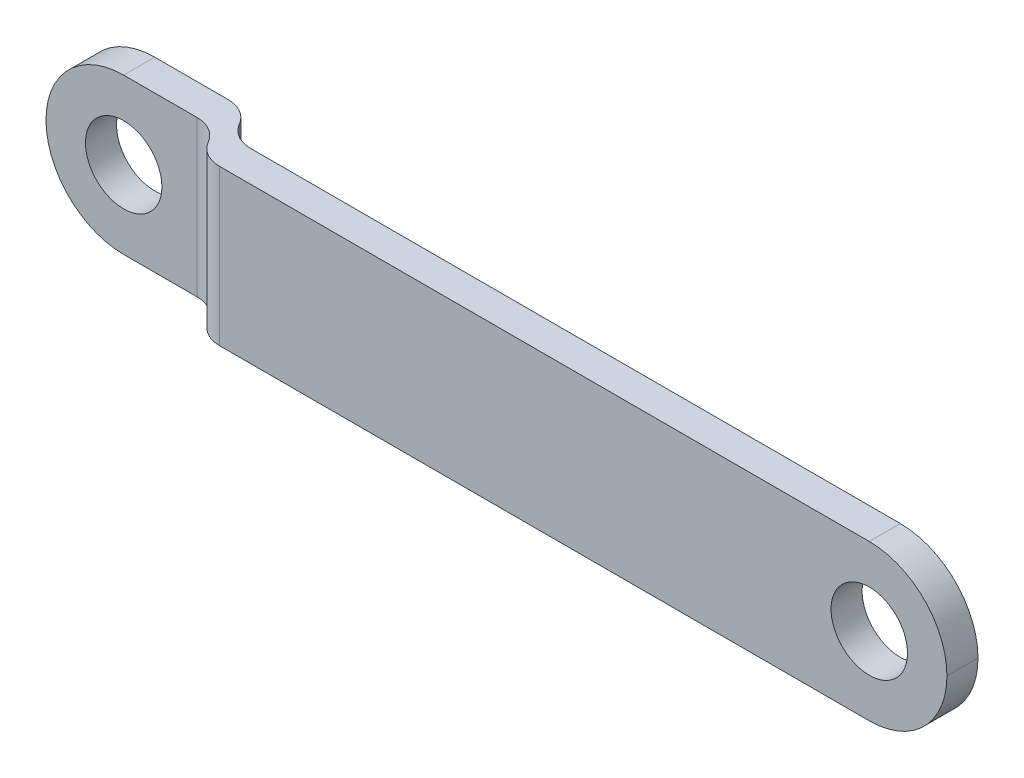
ISO-10303-21;
HEADER;
FILE_DESCRIPTION(('STEP AP214'),'2;1');
FILE_NAME('part.step','',(''),(''),'','','');
FILE_SCHEMA(('AUTOMOTIVE_DESIGN { 1 0 10303 214 1 1 1 1 }'));
ENDSEC;
DATA;
#1=APPLICATION_CONTEXT('core data for automotive mechanical design processes');
#2=APPLICATION_PROTOCOL_DEFINITION('international standard','automotive_design',2000,#1);
#3=PRODUCT_CONTEXT('',#1,'mechanical');
#4=PRODUCT('Part','Part','',(#3));
#5=PRODUCT_RELATED_PRODUCT_CATEGORY('part','',(#4));
#6=PRODUCT_DEFINITION_FORMATION('','',#4);
#7=PRODUCT_DEFINITION_CONTEXT('part definition',#1,'design');
#8=PRODUCT_DEFINITION('design','',#6,#7);
#9=PRODUCT_DEFINITION_SHAPE('','',#8);
#10=(LENGTH_UNIT() NAMED_UNIT(*) SI_UNIT(.MILLI.,.METRE.));
#11=(NAMED_UNIT(*) PLANE_ANGLE_UNIT() SI_UNIT($,.RADIAN.));
#12=(NAMED_UNIT(*) SI_UNIT($,.STERADIAN.) SOLID_ANGLE_UNIT());
#13=UNCERTAINTY_MEASURE_WITH_UNIT(LENGTH_MEASURE(1.E-05),#10,'distance_accuracy_value','');
#14=(GEOMETRIC_REPRESENTATION_CONTEXT(3) GLOBAL_UNCERTAINTY_ASSIGNED_CONTEXT((#13)) GLOBAL_UNIT_ASSIGNED_CONTEXT((#10,
#11,#12)) REPRESENTATION_CONTEXT('',''));
#15=CARTESIAN_POINT('',(0.,0.,0.));
#16=DIRECTION('',(0.,0.,1.));
#17=DIRECTION('',(1.,0.,0.));
#18=AXIS2_PLACEMENT_3D('',#15,#16,#17);
#19=CARTESIAN_POINT('',(-63.5,0.,5.08));
#20=DIRECTION('',(0.,0.,1.));
#21=DIRECTION('',(1.,0.,0.));
#22=AXIS2_PLACEMENT_3D('',#19,#20,#21);
#23=CYLINDRICAL_SURFACE('',#22,6.25);
#24=CARTESIAN_POINT('',(-63.5,0.,-5.08));
#25=DIRECTION('',(0.,0.,1.));
#26=DIRECTION('',(1.,0.,0.));
#27=AXIS2_PLACEMENT_3D('',#24,#25,#26);
#28=CIRCLE('',#27,6.24999999999999);
#29=CARTESIAN_POINT('',(-57.25,0.,-5.08));
#30=VERTEX_POINT('',#29);
#31=EDGE_CURVE('E230',#30,#30,#28,.T.);
#32=ORIENTED_EDGE('',*,*,#31,.F.);
#33=EDGE_LOOP('',(#32));
#34=FACE_BOUND('',#33,.T.);
#35=CARTESIAN_POINT('',(-63.5,0.,0.));
#36=DIRECTION('',(0.,0.,1.));
#37=DIRECTION('',(1.,0.,0.));
#38=AXIS2_PLACEMENT_3D('',#35,#36,#37);
#39=CIRCLE('',#38,6.24999999999999);
#40=CARTESIAN_POINT('',(-57.25,0.,0.));
#41=VERTEX_POINT('',#40);
#42=EDGE_CURVE('E142',#41,#41,#39,.T.);
#43=ORIENTED_EDGE('',*,*,#42,.T.);
#44=EDGE_LOOP('',(#43));
#45=FACE_BOUND('',#44,.T.);
#46=ADVANCED_FACE('F47',(#34,#45),#23,.F.);
#47=CARTESIAN_POINT('',(-63.5,0.,5.08));
#48=DIRECTION('',(0.,0.,-1.));
#49=DIRECTION('',(-1.,0.,0.));
#50=AXIS2_PLACEMENT_3D('',#47,#48,#49);
#51=CYLINDRICAL_SURFACE('',#50,12.7);
#52=DIRECTION('',(0.,0.,-1.));
#53=VECTOR('',#52,1.);
#54=CARTESIAN_POINT('',(-63.5,-12.7,5.08));
#55=LINE('',#54,#53);
#56=CARTESIAN_POINT('',(-63.5,-12.7,0.));
#57=VERTEX_POINT('',#56);
#58=CARTESIAN_POINT('',(-63.5,-12.7,-5.08));
#59=VERTEX_POINT('',#58);
#60=EDGE_CURVE('E147',#57,#59,#55,.T.);
#61=ORIENTED_EDGE('',*,*,#60,.F.);
#62=CARTESIAN_POINT('',(-63.5,0.,0.));
#63=DIRECTION('',(0.,0.,1.));
#64=DIRECTION('',(1.,0.,0.));
#65=AXIS2_PLACEMENT_3D('',#62,#63,#64);
#66=CIRCLE('',#65,12.7);
#67=CARTESIAN_POINT('',(-63.5,12.7,0.));
#68=VERTEX_POINT('',#67);
#69=EDGE_CURVE('E130',#68,#57,#66,.T.);
#70=ORIENTED_EDGE('',*,*,#69,.F.);
#71=DIRECTION('',(0.,0.,-1.));
#72=VECTOR('',#71,1.);
#73=CARTESIAN_POINT('',(-63.5,12.7,5.08));
#74=LINE('',#73,#72);
#75=CARTESIAN_POINT('',(-63.5,12.7,-5.08));
#76=VERTEX_POINT('',#75);
#77=EDGE_CURVE('E181',#76,#68,#74,.F.);
#78=ORIENTED_EDGE('',*,*,#77,.F.);
#79=CARTESIAN_POINT('',(-63.5,0.,-5.08));
#80=DIRECTION('',(0.,0.,1.));
#81=DIRECTION('',(1.,0.,0.));
#82=AXIS2_PLACEMENT_3D('',#79,#80,#81);
#83=CIRCLE('',#82,12.7);
#84=EDGE_CURVE('E154',#76,#59,#83,.T.);
#85=ORIENTED_EDGE('',*,*,#84,.T.);
#86=EDGE_LOOP('',(#61,#70,#78,#85));
#87=FACE_BOUND('',#86,.T.);
#88=ADVANCED_FACE('F152',(#87),#51,.T.);
#89=CARTESIAN_POINT('',(-76.2,12.7,5.08));
#90=DIRECTION('',(0.,-1.,0.));
#91=DIRECTION('',(0.,0.,-1.));
#92=AXIS2_PLACEMENT_3D('',#89,#90,#91);
#93=PLANE('',#92);
#94=CARTESIAN_POINT('',(-42.7249159472084,12.7,-5.08));
#95=DIRECTION('',(0.,-1.,0.));
#96=DIRECTION('',(0.,0.,-1.));
#97=AXIS2_PLACEMENT_3D('',#94,#95,#96);
#98=CIRCLE('',#97,5.08);
#99=CARTESIAN_POINT('',(-42.7249159472084,12.7,0.));
#100=VERTEX_POINT('',#99);
#101=CARTESIAN_POINT('',(-47.1243249984334,12.7,-2.54));
#102=VERTEX_POINT('',#101);
#103=EDGE_CURVE('E196',#100,#102,#98,.T.);
#104=ORIENTED_EDGE('',*,*,#103,.T.);
#105=CARTESIAN_POINT('',(-51.5237340496583,12.7,0.));
#106=DIRECTION('',(0.,-1.,0.));
#107=DIRECTION('',(0.,0.,-1.));
#108=AXIS2_PLACEMENT_3D('',#105,#106,#107);
#109=CIRCLE('',#108,5.08);
#110=CARTESIAN_POINT('',(-51.5237340496583,12.7,-5.08));
#111=VERTEX_POINT('',#110);
#112=EDGE_CURVE('E213',#102,#111,#109,.F.);
#113=ORIENTED_EDGE('',*,*,#112,.T.);
#114=DIRECTION('',(-1.,0.,0.));
#115=VECTOR('',#114,1.);
#116=CARTESIAN_POINT('',(-47.8049159472084,12.7,-5.08));
#117=LINE('',#116,#115);
#118=EDGE_CURVE('E234',#111,#76,#117,.T.);
#119=ORIENTED_EDGE('',*,*,#118,.T.);
#120=ORIENTED_EDGE('',*,*,#77,.T.);
#121=DIRECTION('',(-1.,0.,0.));
#122=VECTOR('',#121,1.);
#123=CARTESIAN_POINT('',(-47.8049159472084,12.7,0.));
#124=LINE('',#123,#122);
#125=CARTESIAN_POINT('',(-51.5237340496583,12.7,0.));
#126=VERTEX_POINT('',#125);
#127=EDGE_CURVE('E136',#126,#68,#124,.T.);
#128=ORIENTED_EDGE('',*,*,#127,.F.);
#129=CARTESIAN_POINT('',(-51.5237340496583,12.7,5.08));
#130=DIRECTION('',(0.,-1.,0.));
#131=DIRECTION('',(0.,0.,-1.));
#132=AXIS2_PLACEMENT_3D('',#129,#130,#131);
#133=CIRCLE('',#132,5.08);
#134=CARTESIAN_POINT('',(-47.1243249984334,12.7,2.54));
#135=VERTEX_POINT('',#134);
#136=EDGE_CURVE('E56',#126,#135,#133,.T.);
#137=ORIENTED_EDGE('',*,*,#136,.T.);
#138=CARTESIAN_POINT('',(-42.7249159472084,12.7,0.));
#139=DIRECTION('',(0.,-1.,0.));
#140=DIRECTION('',(0.,0.,-1.));
#141=AXIS2_PLACEMENT_3D('',#138,#139,#140);
#142=CIRCLE('',#141,5.08);
#143=CARTESIAN_POINT('',(-42.7249159472084,12.7,5.08));
#144=VERTEX_POINT('',#143);
#145=EDGE_CURVE('E200',#135,#144,#142,.F.);
#146=ORIENTED_EDGE('',*,*,#145,.T.);
#147=DIRECTION('',(-1.,0.,0.));
#148=VECTOR('',#147,1.);
#149=CARTESIAN_POINT('',(-76.2,12.7,5.08));
#150=LINE('',#149,#148);
#151=CARTESIAN_POINT('',(63.4999999999999,12.7,5.08));
#152=VERTEX_POINT('',#151);
#153=EDGE_CURVE('E251',#152,#144,#150,.T.);
#154=ORIENTED_EDGE('',*,*,#153,.F.);
#155=DIRECTION('',(0.,0.,-1.));
#156=VECTOR('',#155,1.);
#157=CARTESIAN_POINT('',(63.5,12.7,5.08));
#158=LINE('',#157,#156);
#159=CARTESIAN_POINT('',(63.4999999999999,12.7,0.));
#160=VERTEX_POINT('',#159);
#161=EDGE_CURVE('E178',#152,#160,#158,.T.);
#162=ORIENTED_EDGE('',*,*,#161,.T.);
#163=DIRECTION('',(-1.,0.,0.));
#164=VECTOR('',#163,1.);
#165=CARTESIAN_POINT('',(-76.2,12.7,0.));
#166=LINE('',#165,#164);
#167=EDGE_CURVE('E250',#160,#100,#166,.T.);
#168=ORIENTED_EDGE('',*,*,#167,.T.);
#169=EDGE_LOOP('',(#104,#113,#119,#120,#128,#137,#146,#154,#162,#168));
#170=FACE_BOUND('',#169,.T.);
#171=ADVANCED_FACE('F228',(#170),#93,.F.);
#172=CARTESIAN_POINT('',(-76.2,-12.7,5.08));
#173=DIRECTION('',(0.,1.,0.));
#174=DIRECTION('',(0.,0.,1.));
#175=AXIS2_PLACEMENT_3D('',#172,#173,#174);
#176=PLANE('',#175);
#177=DIRECTION('',(1.,0.,0.));
#178=VECTOR('',#177,1.);
#179=CARTESIAN_POINT('',(-63.5,-12.7,-5.08));
#180=LINE('',#179,#178);
#181=CARTESIAN_POINT('',(-51.5237340496583,-12.7,-5.08));
#182=VERTEX_POINT('',#181);
#183=EDGE_CURVE('E190',#59,#182,#180,.T.);
#184=ORIENTED_EDGE('',*,*,#183,.T.);
#185=CARTESIAN_POINT('',(-51.5237340496583,-12.7,0.));
#186=DIRECTION('',(0.,1.,0.));
#187=DIRECTION('',(0.,0.,1.));
#188=AXIS2_PLACEMENT_3D('',#185,#186,#187);
#189=CIRCLE('',#188,5.08);
#190=CARTESIAN_POINT('',(-47.1243249984334,-12.7,-2.54));
#191=VERTEX_POINT('',#190);
#192=EDGE_CURVE('E219',#182,#191,#189,.F.);
#193=ORIENTED_EDGE('',*,*,#192,.T.);
#194=CARTESIAN_POINT('',(-42.7249159472084,-12.7,-5.08));
#195=DIRECTION('',(0.,1.,0.));
#196=DIRECTION('',(0.,0.,1.));
#197=AXIS2_PLACEMENT_3D('',#194,#195,#196);
#198=CIRCLE('',#197,5.08);
#199=CARTESIAN_POINT('',(-42.7249159472084,-12.7,0.));
#200=VERTEX_POINT('',#199);
#201=EDGE_CURVE('E193',#191,#200,#198,.T.);
#202=ORIENTED_EDGE('',*,*,#201,.T.);
#203=DIRECTION('',(1.,0.,0.));
#204=VECTOR('',#203,1.);
#205=CARTESIAN_POINT('',(-76.2,-12.7,0.));
#206=LINE('',#205,#204);
#207=CARTESIAN_POINT('',(63.4999999999999,-12.7,0.));
#208=VERTEX_POINT('',#207);
#209=EDGE_CURVE('E255',#200,#208,#206,.T.);
#210=ORIENTED_EDGE('',*,*,#209,.T.);
#211=DIRECTION('',(0.,0.,-1.));
#212=VECTOR('',#211,1.);
#213=CARTESIAN_POINT('',(63.5,-12.7,5.08));
#214=LINE('',#213,#212);
#215=CARTESIAN_POINT('',(63.4999999999999,-12.7,5.08));
#216=VERTEX_POINT('',#215);
#217=EDGE_CURVE('E158',#208,#216,#214,.F.);
#218=ORIENTED_EDGE('',*,*,#217,.T.);
#219=DIRECTION('',(1.,0.,0.));
#220=VECTOR('',#219,1.);
#221=CARTESIAN_POINT('',(-76.2,-12.7,5.08));
#222=LINE('',#221,#220);
#223=CARTESIAN_POINT('',(-42.7249159472084,-12.7,5.08));
#224=VERTEX_POINT('',#223);
#225=EDGE_CURVE('E165',#224,#216,#222,.T.);
#226=ORIENTED_EDGE('',*,*,#225,.F.);
#227=CARTESIAN_POINT('',(-42.7249159472084,-12.7,0.));
#228=DIRECTION('',(0.,1.,0.));
#229=DIRECTION('',(0.,0.,1.));
#230=AXIS2_PLACEMENT_3D('',#227,#228,#229);
#231=CIRCLE('',#230,5.08);
#232=CARTESIAN_POINT('',(-47.1243249984334,-12.7,2.54));
#233=VERTEX_POINT('',#232);
#234=EDGE_CURVE('E206',#224,#233,#231,.F.);
#235=ORIENTED_EDGE('',*,*,#234,.T.);
#236=CARTESIAN_POINT('',(-51.5237340496583,-12.7,5.08));
#237=DIRECTION('',(0.,1.,0.));
#238=DIRECTION('',(0.,0.,1.));
#239=AXIS2_PLACEMENT_3D('',#236,#237,#238);
#240=CIRCLE('',#239,5.08);
#241=CARTESIAN_POINT('',(-51.5237340496583,-12.7,0.));
#242=VERTEX_POINT('',#241);
#243=EDGE_CURVE('E12',#233,#242,#240,.T.);
#244=ORIENTED_EDGE('',*,*,#243,.T.);
#245=DIRECTION('',(1.,0.,0.));
#246=VECTOR('',#245,1.);
#247=CARTESIAN_POINT('',(-63.5,-12.7,0.));
#248=LINE('',#247,#246);
#249=EDGE_CURVE('E134',#57,#242,#248,.T.);
#250=ORIENTED_EDGE('',*,*,#249,.F.);
#251=ORIENTED_EDGE('',*,*,#60,.T.);
#252=EDGE_LOOP('',(#184,#193,#202,#210,#218,#226,#235,#244,#250,#251));
#253=FACE_BOUND('',#252,.T.);
#254=ADVANCED_FACE('F146',(#253),#176,.F.);
#255=CARTESIAN_POINT('',(0.,0.,5.08));
#256=DIRECTION('',(0.,0.,-1.));
#257=DIRECTION('',(-1.,0.,0.));
#258=AXIS2_PLACEMENT_3D('',#255,#256,#257);
#259=PLANE('',#258);
#260=CARTESIAN_POINT('',(63.5,0.,5.08));
#261=DIRECTION('',(0.,0.,1.));
#262=DIRECTION('',(1.,0.,0.));
#263=AXIS2_PLACEMENT_3D('',#260,#261,#262);
#264=CIRCLE('',#263,6.24999999999999);
#265=CARTESIAN_POINT('',(69.75,0.,5.08));
#266=VERTEX_POINT('',#265);
#267=EDGE_CURVE('E189',#266,#266,#264,.T.);
#268=ORIENTED_EDGE('',*,*,#267,.F.);
#269=EDGE_LOOP('',(#268));
#270=FACE_BOUND('',#269,.T.);
#271=ORIENTED_EDGE('',*,*,#153,.T.);
#272=DIRECTION('',(0.,1.,0.));
#273=VECTOR('',#272,1.);
#274=CARTESIAN_POINT('',(-42.7249159472084,0.,5.08));
#275=LINE('',#274,#273);
#276=EDGE_CURVE('E203',#144,#224,#275,.F.);
#277=ORIENTED_EDGE('',*,*,#276,.T.);
#278=ORIENTED_EDGE('',*,*,#225,.T.);
#279=CARTESIAN_POINT('',(63.5,0.,5.08));
#280=DIRECTION('',(0.,0.,-1.));
#281=DIRECTION('',(-1.,0.,0.));
#282=AXIS2_PLACEMENT_3D('',#279,#280,#281);
#283=CIRCLE('',#282,12.7);
#284=CARTESIAN_POINT('',(76.2,0.,5.08));
#285=VERTEX_POINT('',#284);
#286=EDGE_CURVE('E175',#216,#285,#283,.F.);
#287=ORIENTED_EDGE('',*,*,#286,.T.);
#288=CARTESIAN_POINT('',(63.5,0.,5.08));
#289=DIRECTION('',(0.,0.,-1.));
#290=DIRECTION('',(-1.,0.,0.));
#291=AXIS2_PLACEMENT_3D('',#288,#289,#290);
#292=CIRCLE('',#291,12.7);
#293=EDGE_CURVE('E172',#285,#152,#292,.F.);
#294=ORIENTED_EDGE('',*,*,#293,.T.);
#295=EDGE_LOOP('',(#271,#277,#278,#287,#294));
#296=FACE_BOUND('',#295,.T.);
#297=ADVANCED_FACE('F278',(#270,#296),#259,.F.);
#298=CARTESIAN_POINT('',(0.,0.,0.));
#299=DIRECTION('',(0.,0.,-1.));
#300=DIRECTION('',(-1.,0.,0.));
#301=AXIS2_PLACEMENT_3D('',#298,#299,#300);
#302=PLANE('',#301);
#303=ORIENTED_EDGE('',*,*,#209,.F.);
#304=DIRECTION('',(0.,-1.,0.));
#305=VECTOR('',#304,1.);
#306=CARTESIAN_POINT('',(-42.7249159472084,12.7,0.));
#307=LINE('',#306,#305);
#308=EDGE_CURVE('E184',#200,#100,#307,.F.);
#309=ORIENTED_EDGE('',*,*,#308,.T.);
#310=ORIENTED_EDGE('',*,*,#167,.F.);
#311=CARTESIAN_POINT('',(63.5,0.,0.));
#312=DIRECTION('',(0.,0.,-1.));
#313=DIRECTION('',(-1.,0.,0.));
#314=AXIS2_PLACEMENT_3D('',#311,#312,#313);
#315=CIRCLE('',#314,12.7);
#316=CARTESIAN_POINT('',(76.2,0.,0.));
#317=VERTEX_POINT('',#316);
#318=EDGE_CURVE('E157',#160,#317,#315,.T.);
#319=ORIENTED_EDGE('',*,*,#318,.T.);
#320=CARTESIAN_POINT('',(63.5,0.,0.));
#321=DIRECTION('',(0.,0.,-1.));
#322=DIRECTION('',(-1.,0.,0.));
#323=AXIS2_PLACEMENT_3D('',#320,#321,#322);
#324=CIRCLE('',#323,12.7);
#325=EDGE_CURVE('E162',#317,#208,#324,.T.);
#326=ORIENTED_EDGE('',*,*,#325,.T.);
#327=EDGE_LOOP('',(#303,#309,#310,#319,#326));
#328=FACE_BOUND('',#327,.T.);
#329=CARTESIAN_POINT('',(63.5,0.,0.));
#330=DIRECTION('',(0.,0.,1.));
#331=DIRECTION('',(1.,0.,0.));
#332=AXIS2_PLACEMENT_3D('',#329,#330,#331);
#333=CIRCLE('',#332,6.25000000000001);
#334=CARTESIAN_POINT('',(69.75,0.,0.));
#335=VERTEX_POINT('',#334);
#336=EDGE_CURVE('E246',#335,#335,#333,.T.);
#337=ORIENTED_EDGE('',*,*,#336,.T.);
#338=EDGE_LOOP('',(#337));
#339=FACE_BOUND('',#338,.T.);
#340=ADVANCED_FACE('F268',(#328,#339),#302,.T.);
#341=CARTESIAN_POINT('',(63.5,0.,5.08));
#342=DIRECTION('',(0.,0.,1.));
#343=DIRECTION('',(1.,0.,0.));
#344=AXIS2_PLACEMENT_3D('',#341,#342,#343);
#345=CYLINDRICAL_SURFACE('',#344,6.25);
#346=ORIENTED_EDGE('',*,*,#336,.F.);
#347=EDGE_LOOP('',(#346));
#348=FACE_BOUND('',#347,.T.);
#349=ORIENTED_EDGE('',*,*,#267,.T.);
#350=EDGE_LOOP('',(#349));
#351=FACE_BOUND('',#350,.T.);
#352=ADVANCED_FACE('F316',(#348,#351),#345,.F.);
#353=CARTESIAN_POINT('',(63.5,0.,5.08));
#354=DIRECTION('',(0.,0.,-1.));
#355=DIRECTION('',(-1.,0.,0.));
#356=AXIS2_PLACEMENT_3D('',#353,#354,#355);
#357=CYLINDRICAL_SURFACE('',#356,12.7);
#358=ORIENTED_EDGE('',*,*,#161,.F.);
#359=ORIENTED_EDGE('',*,*,#293,.F.);
#360=DIRECTION('',(0.,0.,-1.));
#361=VECTOR('',#360,1.);
#362=CARTESIAN_POINT('',(76.2,0.,5.08));
#363=LINE('',#362,#361);
#364=EDGE_CURVE('E185',#317,#285,#363,.F.);
#365=ORIENTED_EDGE('',*,*,#364,.F.);
#366=ORIENTED_EDGE('',*,*,#318,.F.);
#367=EDGE_LOOP('',(#358,#359,#365,#366));
#368=FACE_BOUND('',#367,.T.);
#369=ADVANCED_FACE('F282',(#368),#357,.T.);
#370=CARTESIAN_POINT('',(63.5,0.,5.08));
#371=DIRECTION('',(0.,0.,-1.));
#372=DIRECTION('',(-1.,0.,0.));
#373=AXIS2_PLACEMENT_3D('',#370,#371,#372);
#374=CYLINDRICAL_SURFACE('',#373,12.7);
#375=ORIENTED_EDGE('',*,*,#286,.F.);
#376=ORIENTED_EDGE('',*,*,#217,.F.);
#377=ORIENTED_EDGE('',*,*,#325,.F.);
#378=ORIENTED_EDGE('',*,*,#364,.T.);
#379=EDGE_LOOP('',(#375,#376,#377,#378));
#380=FACE_BOUND('',#379,.T.);
#381=ADVANCED_FACE('F275',(#380),#374,.T.);
#382=CARTESIAN_POINT('',(-63.5,0.,-5.08));
#383=DIRECTION('',(0.,0.,1.));
#384=DIRECTION('',(1.,0.,0.));
#385=AXIS2_PLACEMENT_3D('',#382,#383,#384);
#386=PLANE('',#385);
#387=ORIENTED_EDGE('',*,*,#31,.T.);
#388=EDGE_LOOP('',(#387));
#389=FACE_BOUND('',#388,.T.);
#390=ORIENTED_EDGE('',*,*,#118,.F.);
#391=DIRECTION('',(0.,1.,0.));
#392=VECTOR('',#391,1.);
#393=CARTESIAN_POINT('',(-51.5237340496583,0.,-5.08));
#394=LINE('',#393,#392);
#395=EDGE_CURVE('E216',#111,#182,#394,.F.);
#396=ORIENTED_EDGE('',*,*,#395,.T.);
#397=ORIENTED_EDGE('',*,*,#183,.F.);
#398=ORIENTED_EDGE('',*,*,#84,.F.);
#399=EDGE_LOOP('',(#390,#396,#397,#398));
#400=FACE_BOUND('',#399,.T.);
#401=ADVANCED_FACE('F291',(#389,#400),#386,.F.);
#402=CARTESIAN_POINT('',(-42.7249159472084,-12.7,-5.08));
#403=DIRECTION('',(0.,1.,0.));
#404=DIRECTION('',(0.,0.,1.));
#405=AXIS2_PLACEMENT_3D('',#402,#403,#404);
#406=CYLINDRICAL_SURFACE('',#405,5.08);
#407=ORIENTED_EDGE('',*,*,#201,.F.);
#408=DIRECTION('',(0.,1.,0.));
#409=VECTOR('',#408,1.);
#410=CARTESIAN_POINT('',(-47.1243249984334,-12.7,-2.54));
#411=LINE('',#410,#409);
#412=EDGE_CURVE('E209',#191,#102,#411,.T.);
#413=ORIENTED_EDGE('',*,*,#412,.T.);
#414=ORIENTED_EDGE('',*,*,#103,.F.);
#415=ORIENTED_EDGE('',*,*,#308,.F.);
#416=EDGE_LOOP('',(#407,#413,#414,#415));
#417=FACE_BOUND('',#416,.T.);
#418=ADVANCED_FACE('F285',(#417),#406,.F.);
#419=CARTESIAN_POINT('',(-63.5,0.,0.));
#420=DIRECTION('',(0.,0.,1.));
#421=DIRECTION('',(1.,0.,0.));
#422=AXIS2_PLACEMENT_3D('',#419,#420,#421);
#423=PLANE('',#422);
#424=ORIENTED_EDGE('',*,*,#42,.F.);
#425=EDGE_LOOP('',(#424));
#426=FACE_BOUND('',#425,.T.);
#427=ORIENTED_EDGE('',*,*,#249,.T.);
#428=DIRECTION('',(0.,-1.,0.));
#429=VECTOR('',#428,1.);
#430=CARTESIAN_POINT('',(-51.5237340496583,12.7,0.));
#431=LINE('',#430,#429);
#432=EDGE_CURVE('E222',#242,#126,#431,.F.);
#433=ORIENTED_EDGE('',*,*,#432,.T.);
#434=ORIENTED_EDGE('',*,*,#127,.T.);
#435=ORIENTED_EDGE('',*,*,#69,.T.);
#436=EDGE_LOOP('',(#427,#433,#434,#435));
#437=FACE_BOUND('',#436,.T.);
#438=ADVANCED_FACE('F132',(#426,#437),#423,.T.);
#439=CARTESIAN_POINT('',(-42.7249159472084,12.7,0.));
#440=DIRECTION('',(0.,1.,0.));
#441=DIRECTION('',(0.,0.,1.));
#442=AXIS2_PLACEMENT_3D('',#439,#440,#441);
#443=CYLINDRICAL_SURFACE('',#442,5.08);
#444=ORIENTED_EDGE('',*,*,#145,.F.);
#445=DIRECTION('',(0.,1.,0.));
#446=VECTOR('',#445,1.);
#447=CARTESIAN_POINT('',(-47.1243249984334,12.7,2.54));
#448=LINE('',#447,#446);
#449=EDGE_CURVE('E69',#135,#233,#448,.F.);
#450=ORIENTED_EDGE('',*,*,#449,.T.);
#451=ORIENTED_EDGE('',*,*,#234,.F.);
#452=ORIENTED_EDGE('',*,*,#276,.F.);
#453=EDGE_LOOP('',(#444,#450,#451,#452));
#454=FACE_BOUND('',#453,.T.);
#455=ADVANCED_FACE('F295',(#454),#443,.T.);
#456=CARTESIAN_POINT('',(-51.5237340496583,-12.7,0.));
#457=DIRECTION('',(0.,1.,0.));
#458=DIRECTION('',(0.,0.,1.));
#459=AXIS2_PLACEMENT_3D('',#456,#457,#458);
#460=CYLINDRICAL_SURFACE('',#459,5.08);
#461=ORIENTED_EDGE('',*,*,#192,.F.);
#462=ORIENTED_EDGE('',*,*,#395,.F.);
#463=ORIENTED_EDGE('',*,*,#112,.F.);
#464=ORIENTED_EDGE('',*,*,#412,.F.);
#465=EDGE_LOOP('',(#461,#462,#463,#464));
#466=FACE_BOUND('',#465,.T.);
#467=ADVANCED_FACE('F293',(#466),#460,.T.);
#468=CARTESIAN_POINT('',(-51.5237340496583,12.7,5.08));
#469=DIRECTION('',(0.,1.,0.));
#470=DIRECTION('',(0.,0.,1.));
#471=AXIS2_PLACEMENT_3D('',#468,#469,#470);
#472=CYLINDRICAL_SURFACE('',#471,5.08);
#473=ORIENTED_EDGE('',*,*,#243,.F.);
#474=ORIENTED_EDGE('',*,*,#449,.F.);
#475=ORIENTED_EDGE('',*,*,#136,.F.);
#476=ORIENTED_EDGE('',*,*,#432,.F.);
#477=EDGE_LOOP('',(#473,#474,#475,#476));
#478=FACE_BOUND('',#477,.T.);
#479=ADVANCED_FACE('F49',(#478),#472,.F.);
#480=CLOSED_SHELL('',(#46,#88,#171,#254,#297,#340,#352,#369,#381,#401,#418,#438,#455,#467,#479));
#481=MANIFOLD_SOLID_BREP('B2',#480);
#482=ADVANCED_BREP_SHAPE_REPRESENTATION('',(#18,#481),#14);
#483=SHAPE_DEFINITION_REPRESENTATION(#9,#482);
ENDSEC;
END-ISO-10303-21;
